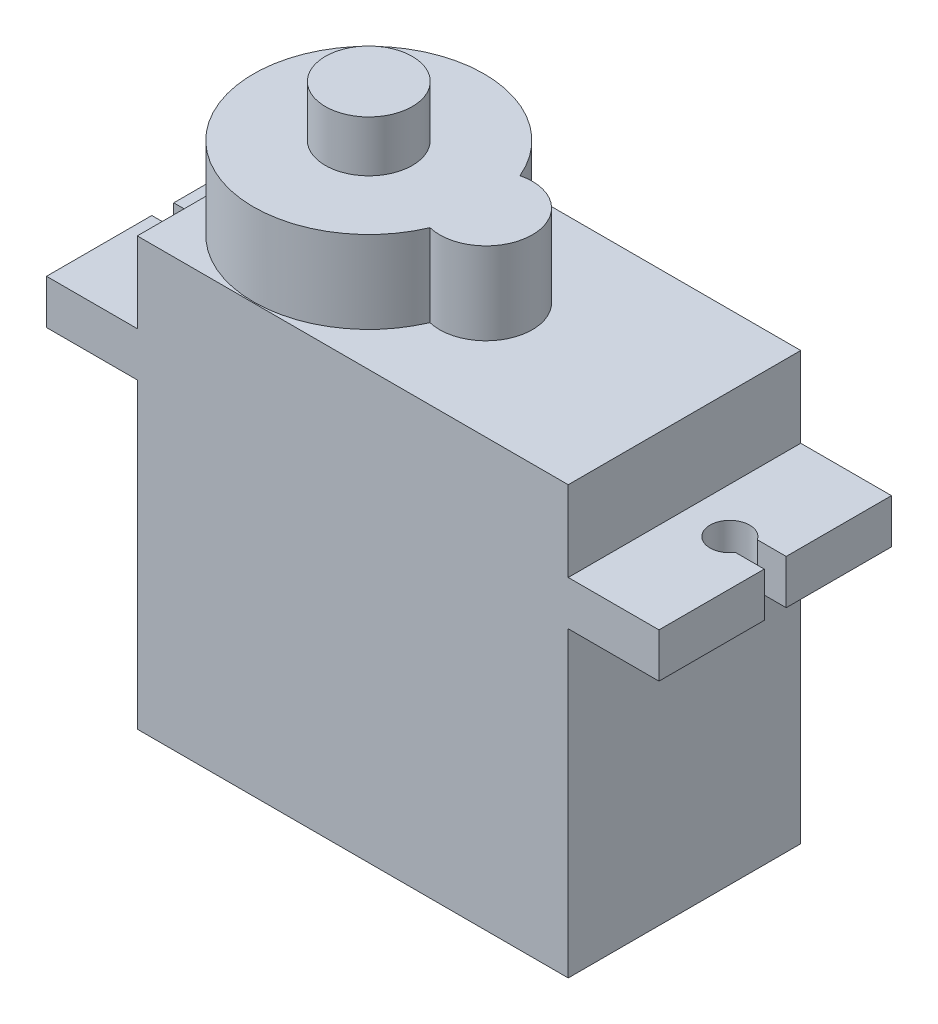
ISO-10303-21;
HEADER;
FILE_DESCRIPTION(('STEP AP214'),'2;1');
FILE_NAME('part.step','',(''),(''),'','','');
FILE_SCHEMA(('AUTOMOTIVE_DESIGN { 1 0 10303 214 1 1 1 1 }'));
ENDSEC;
DATA;
#1=APPLICATION_CONTEXT('core data for automotive mechanical design processes');
#2=APPLICATION_PROTOCOL_DEFINITION('international standard','automotive_design',2000,#1);
#3=PRODUCT_CONTEXT('',#1,'mechanical');
#4=PRODUCT('Part','Part','',(#3));
#5=PRODUCT_RELATED_PRODUCT_CATEGORY('part','',(#4));
#6=PRODUCT_DEFINITION_FORMATION('','',#4);
#7=PRODUCT_DEFINITION_CONTEXT('part definition',#1,'design');
#8=PRODUCT_DEFINITION('design','',#6,#7);
#9=PRODUCT_DEFINITION_SHAPE('','',#8);
#10=(LENGTH_UNIT() NAMED_UNIT(*) SI_UNIT(.MILLI.,.METRE.));
#11=(NAMED_UNIT(*) PLANE_ANGLE_UNIT() SI_UNIT($,.RADIAN.));
#12=(NAMED_UNIT(*) SI_UNIT($,.STERADIAN.) SOLID_ANGLE_UNIT());
#13=UNCERTAINTY_MEASURE_WITH_UNIT(LENGTH_MEASURE(1.E-05),#10,'distance_accuracy_value','');
#14=(GEOMETRIC_REPRESENTATION_CONTEXT(3) GLOBAL_UNCERTAINTY_ASSIGNED_CONTEXT((#13)) GLOBAL_UNIT_ASSIGNED_CONTEXT((#10,
#11,#12)) REPRESENTATION_CONTEXT('',''));
#15=CARTESIAN_POINT('',(0.,0.,0.));
#16=DIRECTION('',(0.,0.,1.));
#17=DIRECTION('',(1.,0.,0.));
#18=AXIS2_PLACEMENT_3D('',#15,#16,#17);
#19=CARTESIAN_POINT('',(-2.2,26.95,0.));
#20=DIRECTION('',(0.,1.,0.));
#21=DIRECTION('',(0.,0.,1.));
#22=AXIS2_PLACEMENT_3D('',#19,#20,#21);
#23=PLANE('',#22);
#24=CARTESIAN_POINT('',(0.900000000000003,26.95,0.));
#25=DIRECTION('',(0.,1.,0.));
#26=DIRECTION('',(0.,0.,1.));
#27=AXIS2_PLACEMENT_3D('',#24,#25,#26);
#28=CIRCLE('',#27,2.45195906275424);
#29=CARTESIAN_POINT('',(0.315959415691723,26.95,2.38138611764315));
#30=VERTEX_POINT('',#29);
#31=CARTESIAN_POINT('',(0.315959415691723,26.95,-2.38138611764315));
#32=VERTEX_POINT('',#31);
#33=EDGE_CURVE('E195',#30,#32,#28,.T.);
#34=ORIENTED_EDGE('',*,*,#33,.T.);
#35=CARTESIAN_POINT('',(-5.3,26.95,0.));
#36=DIRECTION('',(0.,1.,0.));
#37=DIRECTION('',(0.,0.,1.));
#38=AXIS2_PLACEMENT_3D('',#35,#36,#37);
#39=CIRCLE('',#38,6.1);
#40=EDGE_CURVE('E185',#32,#30,#39,.T.);
#41=ORIENTED_EDGE('',*,*,#40,.T.);
#42=EDGE_LOOP('',(#34,#41));
#43=FACE_BOUND('',#42,.T.);
#44=CARTESIAN_POINT('',(-5.3,26.95,0.));
#45=DIRECTION('',(0.,1.,0.));
#46=DIRECTION('',(0.,0.,1.));
#47=AXIS2_PLACEMENT_3D('',#44,#45,#46);
#48=CIRCLE('',#47,2.3);
#49=CARTESIAN_POINT('',(-5.3,26.95,-2.3));
#50=VERTEX_POINT('',#49);
#51=EDGE_CURVE('E704',#50,#50,#48,.T.);
#52=ORIENTED_EDGE('',*,*,#51,.F.);
#53=EDGE_LOOP('',(#52));
#54=FACE_BOUND('',#53,.T.);
#55=ADVANCED_FACE('F35',(#43,#54),#23,.T.);
#56=CARTESIAN_POINT('',(-11.4,22.6,6.15));
#57=DIRECTION('',(0.,-1.,0.));
#58=DIRECTION('',(0.,0.,-1.));
#59=AXIS2_PLACEMENT_3D('',#56,#57,#58);
#60=PLANE('',#59);
#61=CARTESIAN_POINT('',(0.900000000000003,22.6,0.));
#62=DIRECTION('',(0.,1.,0.));
#63=DIRECTION('',(0.,0.,1.));
#64=AXIS2_PLACEMENT_3D('',#61,#62,#63);
#65=CIRCLE('',#64,2.45195906275424);
#66=CARTESIAN_POINT('',(0.315959415691723,22.6,2.38138611764315));
#67=VERTEX_POINT('',#66);
#68=CARTESIAN_POINT('',(0.315959415691723,22.6,-2.38138611764315));
#69=VERTEX_POINT('',#68);
#70=EDGE_CURVE('E201',#67,#69,#65,.T.);
#71=ORIENTED_EDGE('',*,*,#70,.F.);
#72=CARTESIAN_POINT('',(-5.3,22.6,0.));
#73=DIRECTION('',(0.,1.,0.));
#74=DIRECTION('',(0.,0.,1.));
#75=AXIS2_PLACEMENT_3D('',#72,#73,#74);
#76=CIRCLE('',#75,6.1);
#77=CARTESIAN_POINT('',(-11.4,22.6,0.));
#78=VERTEX_POINT('',#77);
#79=EDGE_CURVE('E11',#78,#67,#76,.T.);
#80=ORIENTED_EDGE('',*,*,#79,.F.);
#81=DIRECTION('',(0.,0.,1.));
#82=VECTOR('',#81,1.);
#83=CARTESIAN_POINT('',(-11.4,22.6,-6.15));
#84=LINE('',#83,#82);
#85=CARTESIAN_POINT('',(-11.4,22.6,6.15));
#86=VERTEX_POINT('',#85);
#87=EDGE_CURVE('E253',#78,#86,#84,.T.);
#88=ORIENTED_EDGE('',*,*,#87,.T.);
#89=DIRECTION('',(1.,0.,0.));
#90=VECTOR('',#89,1.);
#91=CARTESIAN_POINT('',(11.4,22.6,6.15));
#92=LINE('',#91,#90);
#93=CARTESIAN_POINT('',(11.4,22.6,6.15));
#94=VERTEX_POINT('',#93);
#95=EDGE_CURVE('E252',#86,#94,#92,.T.);
#96=ORIENTED_EDGE('',*,*,#95,.T.);
#97=DIRECTION('',(0.,0.,-1.));
#98=VECTOR('',#97,1.);
#99=CARTESIAN_POINT('',(11.4,22.6,-6.15));
#100=LINE('',#99,#98);
#101=CARTESIAN_POINT('',(11.4,22.6,-6.15));
#102=VERTEX_POINT('',#101);
#103=EDGE_CURVE('E255',#94,#102,#100,.T.);
#104=ORIENTED_EDGE('',*,*,#103,.T.);
#105=DIRECTION('',(-1.,0.,0.));
#106=VECTOR('',#105,1.);
#107=CARTESIAN_POINT('',(11.4,22.6,-6.15));
#108=LINE('',#107,#106);
#109=CARTESIAN_POINT('',(-11.4,22.6,-6.15));
#110=VERTEX_POINT('',#109);
#111=EDGE_CURVE('E257',#102,#110,#108,.T.);
#112=ORIENTED_EDGE('',*,*,#111,.T.);
#113=EDGE_CURVE('E250',#110,#78,#84,.T.);
#114=ORIENTED_EDGE('',*,*,#113,.T.);
#115=EDGE_CURVE('E45',#69,#78,#76,.T.);
#116=ORIENTED_EDGE('',*,*,#115,.F.);
#117=EDGE_LOOP('',(#71,#80,#88,#96,#104,#112,#114,#116));
#118=FACE_BOUND('',#117,.T.);
#119=ADVANCED_FACE('F316',(#118),#60,.F.);
#120=CARTESIAN_POINT('',(-16.2,18.35,-6.15));
#121=DIRECTION('',(1.,0.,0.));
#122=DIRECTION('',(0.,0.,-1.));
#123=AXIS2_PLACEMENT_3D('',#120,#121,#122);
#124=PLANE('',#123);
#125=DIRECTION('',(0.,0.,1.));
#126=VECTOR('',#125,1.);
#127=CARTESIAN_POINT('',(-16.2,16.,-6.15));
#128=LINE('',#127,#126);
#129=CARTESIAN_POINT('',(-16.2,16.,-6.15));
#130=VERTEX_POINT('',#129);
#131=CARTESIAN_POINT('',(-16.2,16.,-0.579999999999995));
#132=VERTEX_POINT('',#131);
#133=EDGE_CURVE('E627',#130,#132,#128,.T.);
#134=ORIENTED_EDGE('',*,*,#133,.T.);
#135=DIRECTION('',(0.,1.,0.));
#136=VECTOR('',#135,1.);
#137=CARTESIAN_POINT('',(-16.2,18.35,-0.579999999999995));
#138=LINE('',#137,#136);
#139=CARTESIAN_POINT('',(-16.2,18.35,-0.579999999999995));
#140=VERTEX_POINT('',#139);
#141=EDGE_CURVE('E278',#132,#140,#138,.T.);
#142=ORIENTED_EDGE('',*,*,#141,.T.);
#143=DIRECTION('',(0.,0.,1.));
#144=VECTOR('',#143,1.);
#145=CARTESIAN_POINT('',(-16.2,18.35,-6.15));
#146=LINE('',#145,#144);
#147=CARTESIAN_POINT('',(-16.2,18.35,-6.15));
#148=VERTEX_POINT('',#147);
#149=EDGE_CURVE('E302',#148,#140,#146,.T.);
#150=ORIENTED_EDGE('',*,*,#149,.F.);
#151=DIRECTION('',(0.,-1.,0.));
#152=VECTOR('',#151,1.);
#153=CARTESIAN_POINT('',(-16.2,18.35,-6.15));
#154=LINE('',#153,#152);
#155=EDGE_CURVE('E590',#148,#130,#154,.T.);
#156=ORIENTED_EDGE('',*,*,#155,.T.);
#157=EDGE_LOOP('',(#134,#142,#150,#156));
#158=FACE_BOUND('',#157,.T.);
#159=ADVANCED_FACE('F321',(#158),#124,.F.);
#160=CARTESIAN_POINT('',(16.2,18.35,-6.15));
#161=DIRECTION('',(-1.,0.,0.));
#162=DIRECTION('',(0.,0.,1.));
#163=AXIS2_PLACEMENT_3D('',#160,#161,#162);
#164=PLANE('',#163);
#165=DIRECTION('',(0.,0.,-1.));
#166=VECTOR('',#165,1.);
#167=CARTESIAN_POINT('',(16.2,16.,-6.15));
#168=LINE('',#167,#166);
#169=CARTESIAN_POINT('',(16.2,16.,6.15));
#170=VERTEX_POINT('',#169);
#171=CARTESIAN_POINT('',(16.2,16.,0.579999999999998));
#172=VERTEX_POINT('',#171);
#173=EDGE_CURVE('E621',#170,#172,#168,.T.);
#174=ORIENTED_EDGE('',*,*,#173,.T.);
#175=DIRECTION('',(0.,1.,0.));
#176=VECTOR('',#175,1.);
#177=CARTESIAN_POINT('',(16.2,14.1,0.579999999999998));
#178=LINE('',#177,#176);
#179=CARTESIAN_POINT('',(16.2,18.35,0.579999999999998));
#180=VERTEX_POINT('',#179);
#181=EDGE_CURVE('E232',#172,#180,#178,.T.);
#182=ORIENTED_EDGE('',*,*,#181,.T.);
#183=DIRECTION('',(0.,0.,-1.));
#184=VECTOR('',#183,1.);
#185=CARTESIAN_POINT('',(16.2,18.35,-6.15));
#186=LINE('',#185,#184);
#187=CARTESIAN_POINT('',(16.2,18.35,6.15));
#188=VERTEX_POINT('',#187);
#189=EDGE_CURVE('E668',#188,#180,#186,.T.);
#190=ORIENTED_EDGE('',*,*,#189,.F.);
#191=DIRECTION('',(0.,-1.,0.));
#192=VECTOR('',#191,1.);
#193=CARTESIAN_POINT('',(16.2,18.35,6.15));
#194=LINE('',#193,#192);
#195=EDGE_CURVE('E634',#188,#170,#194,.T.);
#196=ORIENTED_EDGE('',*,*,#195,.T.);
#197=EDGE_LOOP('',(#174,#182,#190,#196));
#198=FACE_BOUND('',#197,.T.);
#199=ADVANCED_FACE('F430',(#198),#164,.F.);
#200=CARTESIAN_POINT('',(16.2,18.35,6.15));
#201=DIRECTION('',(0.,1.,0.));
#202=DIRECTION('',(0.,0.,1.));
#203=AXIS2_PLACEMENT_3D('',#200,#201,#202);
#204=PLANE('',#203);
#205=DIRECTION('',(-1.,0.,0.));
#206=VECTOR('',#205,1.);
#207=CARTESIAN_POINT('',(-16.2,18.35,-0.579999999999995));
#208=LINE('',#207,#206);
#209=CARTESIAN_POINT('',(-14.6752713864854,18.35,-0.579999999999995));
#210=VERTEX_POINT('',#209);
#211=EDGE_CURVE('E211',#210,#140,#208,.T.);
#212=ORIENTED_EDGE('',*,*,#211,.F.);
#213=CARTESIAN_POINT('',(-13.8,18.35,0.));
#214=DIRECTION('',(0.,1.,0.));
#215=DIRECTION('',(0.,0.,-1.));
#216=AXIS2_PLACEMENT_3D('',#213,#214,#215);
#217=CIRCLE('',#216,1.05);
#218=CARTESIAN_POINT('',(-14.6752713864854,18.35,0.580000000000003));
#219=VERTEX_POINT('',#218);
#220=EDGE_CURVE('E205',#219,#210,#217,.T.);
#221=ORIENTED_EDGE('',*,*,#220,.F.);
#222=DIRECTION('',(1.,0.,0.));
#223=VECTOR('',#222,1.);
#224=CARTESIAN_POINT('',(-16.2,18.35,0.580000000000004));
#225=LINE('',#224,#223);
#226=CARTESIAN_POINT('',(-16.2,18.35,0.580000000000004));
#227=VERTEX_POINT('',#226);
#228=EDGE_CURVE('E202',#227,#219,#225,.T.);
#229=ORIENTED_EDGE('',*,*,#228,.F.);
#230=CARTESIAN_POINT('',(-16.2,18.35,6.15));
#231=VERTEX_POINT('',#230);
#232=EDGE_CURVE('E666',#227,#231,#146,.T.);
#233=ORIENTED_EDGE('',*,*,#232,.T.);
#234=DIRECTION('',(1.,0.,0.));
#235=VECTOR('',#234,1.);
#236=CARTESIAN_POINT('',(-16.2,18.35,6.15));
#237=LINE('',#236,#235);
#238=CARTESIAN_POINT('',(-11.4,18.35,6.15));
#239=VERTEX_POINT('',#238);
#240=EDGE_CURVE('E649',#231,#239,#237,.T.);
#241=ORIENTED_EDGE('',*,*,#240,.T.);
#242=DIRECTION('',(0.,0.,1.));
#243=VECTOR('',#242,1.);
#244=CARTESIAN_POINT('',(-11.4,18.35,-6.15));
#245=LINE('',#244,#243);
#246=CARTESIAN_POINT('',(-11.4,18.35,-6.15));
#247=VERTEX_POINT('',#246);
#248=EDGE_CURVE('E249',#247,#239,#245,.T.);
#249=ORIENTED_EDGE('',*,*,#248,.F.);
#250=DIRECTION('',(-1.,0.,0.));
#251=VECTOR('',#250,1.);
#252=CARTESIAN_POINT('',(-16.2,18.35,-6.15));
#253=LINE('',#252,#251);
#254=EDGE_CURVE('E659',#247,#148,#253,.T.);
#255=ORIENTED_EDGE('',*,*,#254,.T.);
#256=ORIENTED_EDGE('',*,*,#149,.T.);
#257=EDGE_LOOP('',(#212,#221,#229,#233,#241,#249,#255,#256));
#258=FACE_BOUND('',#257,.T.);
#259=ADVANCED_FACE('F301',(#258),#204,.T.);
#260=CARTESIAN_POINT('',(-11.4,16.,-6.15));
#261=DIRECTION('',(1.,0.,0.));
#262=DIRECTION('',(0.,0.,-1.));
#263=AXIS2_PLACEMENT_3D('',#260,#261,#262);
#264=PLANE('',#263);
#265=DIRECTION('',(0.,0.,1.));
#266=VECTOR('',#265,1.);
#267=CARTESIAN_POINT('',(-11.4,0.,-6.15));
#268=LINE('',#267,#266);
#269=CARTESIAN_POINT('',(-11.4,0.,-6.15));
#270=VERTEX_POINT('',#269);
#271=CARTESIAN_POINT('',(-11.4,0.,6.15));
#272=VERTEX_POINT('',#271);
#273=EDGE_CURVE('E578',#270,#272,#268,.T.);
#274=ORIENTED_EDGE('',*,*,#273,.T.);
#275=DIRECTION('',(0.,-1.,0.));
#276=VECTOR('',#275,1.);
#277=CARTESIAN_POINT('',(-11.4,16.,6.15));
#278=LINE('',#277,#276);
#279=CARTESIAN_POINT('',(-11.4,16.,6.15));
#280=VERTEX_POINT('',#279);
#281=EDGE_CURVE('E279',#280,#272,#278,.T.);
#282=ORIENTED_EDGE('',*,*,#281,.F.);
#283=DIRECTION('',(0.,0.,1.));
#284=VECTOR('',#283,1.);
#285=CARTESIAN_POINT('',(-11.4,16.,-6.15));
#286=LINE('',#285,#284);
#287=CARTESIAN_POINT('',(-11.4,16.,-6.15));
#288=VERTEX_POINT('',#287);
#289=EDGE_CURVE('E599',#288,#280,#286,.T.);
#290=ORIENTED_EDGE('',*,*,#289,.F.);
#291=DIRECTION('',(0.,-1.,0.));
#292=VECTOR('',#291,1.);
#293=CARTESIAN_POINT('',(-11.4,16.,-6.15));
#294=LINE('',#293,#292);
#295=EDGE_CURVE('E582',#288,#270,#294,.T.);
#296=ORIENTED_EDGE('',*,*,#295,.T.);
#297=EDGE_LOOP('',(#274,#282,#290,#296));
#298=FACE_BOUND('',#297,.T.);
#299=ADVANCED_FACE('F37',(#298),#264,.F.);
#300=CARTESIAN_POINT('',(11.4,16.,6.15));
#301=DIRECTION('',(0.,0.,-1.));
#302=DIRECTION('',(-1.,0.,0.));
#303=AXIS2_PLACEMENT_3D('',#300,#301,#302);
#304=PLANE('',#303);
#305=DIRECTION('',(1.,0.,0.));
#306=VECTOR('',#305,1.);
#307=CARTESIAN_POINT('',(11.4,0.,6.15));
#308=LINE('',#307,#306);
#309=CARTESIAN_POINT('',(11.4,0.,6.15));
#310=VERTEX_POINT('',#309);
#311=EDGE_CURVE('E584',#272,#310,#308,.T.);
#312=ORIENTED_EDGE('',*,*,#311,.T.);
#313=DIRECTION('',(0.,-1.,0.));
#314=VECTOR('',#313,1.);
#315=CARTESIAN_POINT('',(11.4,16.,6.15));
#316=LINE('',#315,#314);
#317=CARTESIAN_POINT('',(11.4,16.,6.15));
#318=VERTEX_POINT('',#317);
#319=EDGE_CURVE('E603',#318,#310,#316,.T.);
#320=ORIENTED_EDGE('',*,*,#319,.F.);
#321=DIRECTION('',(1.,0.,0.));
#322=VECTOR('',#321,1.);
#323=CARTESIAN_POINT('',(-16.2,16.,6.15));
#324=LINE('',#323,#322);
#325=EDGE_CURVE('E630',#318,#170,#324,.T.);
#326=ORIENTED_EDGE('',*,*,#325,.T.);
#327=ORIENTED_EDGE('',*,*,#195,.F.);
#328=CARTESIAN_POINT('',(11.4,18.35,6.15));
#329=VERTEX_POINT('',#328);
#330=EDGE_CURVE('E654',#329,#188,#237,.T.);
#331=ORIENTED_EDGE('',*,*,#330,.F.);
#332=DIRECTION('',(0.,-1.,0.));
#333=VECTOR('',#332,1.);
#334=CARTESIAN_POINT('',(11.4,22.6,6.15));
#335=LINE('',#334,#333);
#336=EDGE_CURVE('E715',#94,#329,#335,.T.);
#337=ORIENTED_EDGE('',*,*,#336,.F.);
#338=ORIENTED_EDGE('',*,*,#95,.F.);
#339=DIRECTION('',(0.,-1.,0.));
#340=VECTOR('',#339,1.);
#341=CARTESIAN_POINT('',(-11.4,22.6,6.15));
#342=LINE('',#341,#340);
#343=EDGE_CURVE('E693',#86,#239,#342,.T.);
#344=ORIENTED_EDGE('',*,*,#343,.T.);
#345=ORIENTED_EDGE('',*,*,#240,.F.);
#346=DIRECTION('',(0.,-1.,0.));
#347=VECTOR('',#346,1.);
#348=CARTESIAN_POINT('',(-16.2,18.35,6.15));
#349=LINE('',#348,#347);
#350=CARTESIAN_POINT('',(-16.2,16.,6.15));
#351=VERTEX_POINT('',#350);
#352=EDGE_CURVE('E643',#231,#351,#349,.T.);
#353=ORIENTED_EDGE('',*,*,#352,.T.);
#354=EDGE_CURVE('E638',#351,#280,#324,.T.);
#355=ORIENTED_EDGE('',*,*,#354,.T.);
#356=ORIENTED_EDGE('',*,*,#281,.T.);
#357=EDGE_LOOP('',(#312,#320,#326,#327,#331,#337,#338,#344,#345,#353,#355,#356));
#358=FACE_BOUND('',#357,.T.);
#359=ADVANCED_FACE('F479',(#358),#304,.F.);
#360=CARTESIAN_POINT('',(11.4,16.,-6.15));
#361=DIRECTION('',(-1.,0.,0.));
#362=DIRECTION('',(0.,0.,1.));
#363=AXIS2_PLACEMENT_3D('',#360,#361,#362);
#364=PLANE('',#363);
#365=DIRECTION('',(0.,0.,-1.));
#366=VECTOR('',#365,1.);
#367=CARTESIAN_POINT('',(11.4,0.,-6.15));
#368=LINE('',#367,#366);
#369=CARTESIAN_POINT('',(11.4,0.,-6.15));
#370=VERTEX_POINT('',#369);
#371=EDGE_CURVE('E587',#310,#370,#368,.T.);
#372=ORIENTED_EDGE('',*,*,#371,.T.);
#373=DIRECTION('',(0.,-1.,0.));
#374=VECTOR('',#373,1.);
#375=CARTESIAN_POINT('',(11.4,16.,-6.15));
#376=LINE('',#375,#374);
#377=CARTESIAN_POINT('',(11.4,16.,-6.15));
#378=VERTEX_POINT('',#377);
#379=EDGE_CURVE('E600',#378,#370,#376,.T.);
#380=ORIENTED_EDGE('',*,*,#379,.F.);
#381=DIRECTION('',(0.,0.,-1.));
#382=VECTOR('',#381,1.);
#383=CARTESIAN_POINT('',(11.4,16.,-6.15));
#384=LINE('',#383,#382);
#385=EDGE_CURVE('E606',#318,#378,#384,.T.);
#386=ORIENTED_EDGE('',*,*,#385,.F.);
#387=ORIENTED_EDGE('',*,*,#319,.T.);
#388=EDGE_LOOP('',(#372,#380,#386,#387));
#389=FACE_BOUND('',#388,.T.);
#390=ADVANCED_FACE('F469',(#389),#364,.F.);
#391=CARTESIAN_POINT('',(11.4,16.,-6.15));
#392=DIRECTION('',(0.,0.,1.));
#393=DIRECTION('',(1.,0.,0.));
#394=AXIS2_PLACEMENT_3D('',#391,#392,#393);
#395=PLANE('',#394);
#396=DIRECTION('',(-1.,0.,0.));
#397=VECTOR('',#396,1.);
#398=CARTESIAN_POINT('',(11.4,0.,-6.15));
#399=LINE('',#398,#397);
#400=EDGE_CURVE('E597',#370,#270,#399,.T.);
#401=ORIENTED_EDGE('',*,*,#400,.T.);
#402=ORIENTED_EDGE('',*,*,#295,.F.);
#403=DIRECTION('',(-1.,0.,0.));
#404=VECTOR('',#403,1.);
#405=CARTESIAN_POINT('',(-16.2,16.,-6.15));
#406=LINE('',#405,#404);
#407=EDGE_CURVE('E617',#288,#130,#406,.T.);
#408=ORIENTED_EDGE('',*,*,#407,.T.);
#409=ORIENTED_EDGE('',*,*,#155,.F.);
#410=ORIENTED_EDGE('',*,*,#254,.F.);
#411=DIRECTION('',(0.,-1.,0.));
#412=VECTOR('',#411,1.);
#413=CARTESIAN_POINT('',(-11.4,22.6,-6.15));
#414=LINE('',#413,#412);
#415=EDGE_CURVE('E259',#110,#247,#414,.T.);
#416=ORIENTED_EDGE('',*,*,#415,.F.);
#417=ORIENTED_EDGE('',*,*,#111,.F.);
#418=DIRECTION('',(0.,-1.,0.));
#419=VECTOR('',#418,1.);
#420=CARTESIAN_POINT('',(11.4,22.6,-6.15));
#421=LINE('',#420,#419);
#422=CARTESIAN_POINT('',(11.4,18.35,-6.15));
#423=VERTEX_POINT('',#422);
#424=EDGE_CURVE('E273',#102,#423,#421,.T.);
#425=ORIENTED_EDGE('',*,*,#424,.T.);
#426=CARTESIAN_POINT('',(16.2,18.35,-6.15));
#427=VERTEX_POINT('',#426);
#428=EDGE_CURVE('E670',#427,#423,#253,.T.);
#429=ORIENTED_EDGE('',*,*,#428,.F.);
#430=DIRECTION('',(0.,-1.,0.));
#431=VECTOR('',#430,1.);
#432=CARTESIAN_POINT('',(16.2,18.35,-6.15));
#433=LINE('',#432,#431);
#434=CARTESIAN_POINT('',(16.2,16.,-6.15));
#435=VERTEX_POINT('',#434);
#436=EDGE_CURVE('E585',#427,#435,#433,.T.);
#437=ORIENTED_EDGE('',*,*,#436,.T.);
#438=EDGE_CURVE('E620',#435,#378,#406,.T.);
#439=ORIENTED_EDGE('',*,*,#438,.T.);
#440=ORIENTED_EDGE('',*,*,#379,.T.);
#441=EDGE_LOOP('',(#401,#402,#408,#409,#410,#416,#417,#425,#429,#437,#439,#440));
#442=FACE_BOUND('',#441,.T.);
#443=ADVANCED_FACE('F462',(#442),#395,.F.);
#444=CARTESIAN_POINT('',(-11.4,0.,6.15));
#445=DIRECTION('',(0.,-1.,0.));
#446=DIRECTION('',(0.,0.,-1.));
#447=AXIS2_PLACEMENT_3D('',#444,#445,#446);
#448=PLANE('',#447);
#449=ORIENTED_EDGE('',*,*,#273,.F.);
#450=ORIENTED_EDGE('',*,*,#400,.F.);
#451=ORIENTED_EDGE('',*,*,#371,.F.);
#452=ORIENTED_EDGE('',*,*,#311,.F.);
#453=EDGE_LOOP('',(#449,#450,#451,#452));
#454=FACE_BOUND('',#453,.T.);
#455=ADVANCED_FACE('F468',(#454),#448,.T.);
#456=CARTESIAN_POINT('',(16.2,16.,6.15));
#457=DIRECTION('',(0.,1.,0.));
#458=DIRECTION('',(0.,0.,1.));
#459=AXIS2_PLACEMENT_3D('',#456,#457,#458);
#460=PLANE('',#459);
#461=CARTESIAN_POINT('',(-13.8,16.,0.));
#462=DIRECTION('',(0.,1.,0.));
#463=DIRECTION('',(0.,0.,1.));
#464=AXIS2_PLACEMENT_3D('',#461,#462,#463);
#465=CIRCLE('',#464,1.05);
#466=CARTESIAN_POINT('',(-14.6752713864854,16.,0.580000000000003));
#467=VERTEX_POINT('',#466);
#468=CARTESIAN_POINT('',(-14.6752713864854,16.,-0.579999999999995));
#469=VERTEX_POINT('',#468);
#470=EDGE_CURVE('E39',#467,#469,#465,.T.);
#471=ORIENTED_EDGE('',*,*,#470,.T.);
#472=DIRECTION('',(-1.,0.,0.));
#473=VECTOR('',#472,1.);
#474=CARTESIAN_POINT('',(16.2,16.,-0.579999999999995));
#475=LINE('',#474,#473);
#476=EDGE_CURVE('E220',#469,#132,#475,.T.);
#477=ORIENTED_EDGE('',*,*,#476,.T.);
#478=ORIENTED_EDGE('',*,*,#133,.F.);
#479=ORIENTED_EDGE('',*,*,#407,.F.);
#480=ORIENTED_EDGE('',*,*,#289,.T.);
#481=ORIENTED_EDGE('',*,*,#354,.F.);
#482=CARTESIAN_POINT('',(-16.2,16.,0.580000000000003));
#483=VERTEX_POINT('',#482);
#484=EDGE_CURVE('E631',#483,#351,#128,.T.);
#485=ORIENTED_EDGE('',*,*,#484,.F.);
#486=DIRECTION('',(1.,0.,0.));
#487=VECTOR('',#486,1.);
#488=CARTESIAN_POINT('',(16.2,16.,0.580000000000017));
#489=LINE('',#488,#487);
#490=EDGE_CURVE('E216',#483,#467,#489,.T.);
#491=ORIENTED_EDGE('',*,*,#490,.T.);
#492=EDGE_LOOP('',(#471,#477,#478,#479,#480,#481,#485,#491));
#493=FACE_BOUND('',#492,.T.);
#494=ADVANCED_FACE('F287',(#493),#460,.F.);
#495=CARTESIAN_POINT('',(13.8,16.,0.));
#496=DIRECTION('',(0.,1.,0.));
#497=DIRECTION('',(0.,0.,1.));
#498=AXIS2_PLACEMENT_3D('',#495,#496,#497);
#499=CIRCLE('',#498,1.05);
#500=CARTESIAN_POINT('',(14.6752713864854,16.,-0.58));
#501=VERTEX_POINT('',#500);
#502=CARTESIAN_POINT('',(14.6752713864854,16.,0.579999999999999));
#503=VERTEX_POINT('',#502);
#504=EDGE_CURVE('E243',#501,#503,#499,.T.);
#505=ORIENTED_EDGE('',*,*,#504,.T.);
#506=DIRECTION('',(1.,0.,0.));
#507=VECTOR('',#506,1.);
#508=CARTESIAN_POINT('',(16.2,16.,0.579999999999998));
#509=LINE('',#508,#507);
#510=EDGE_CURVE('E246',#503,#172,#509,.T.);
#511=ORIENTED_EDGE('',*,*,#510,.T.);
#512=ORIENTED_EDGE('',*,*,#173,.F.);
#513=ORIENTED_EDGE('',*,*,#325,.F.);
#514=ORIENTED_EDGE('',*,*,#385,.T.);
#515=ORIENTED_EDGE('',*,*,#438,.F.);
#516=CARTESIAN_POINT('',(16.2,16.,-0.58));
#517=VERTEX_POINT('',#516);
#518=EDGE_CURVE('E691',#517,#435,#168,.T.);
#519=ORIENTED_EDGE('',*,*,#518,.F.);
#520=DIRECTION('',(-1.,0.,0.));
#521=VECTOR('',#520,1.);
#522=CARTESIAN_POINT('',(16.2,16.,-0.58));
#523=LINE('',#522,#521);
#524=EDGE_CURVE('E235',#517,#501,#523,.T.);
#525=ORIENTED_EDGE('',*,*,#524,.T.);
#526=EDGE_LOOP('',(#505,#511,#512,#513,#514,#515,#519,#525));
#527=FACE_BOUND('',#526,.T.);
#528=ADVANCED_FACE('F516',(#527),#460,.F.);
#529=CARTESIAN_POINT('',(16.2,18.35,-0.580000000000001));
#530=VERTEX_POINT('',#529);
#531=EDGE_CURVE('E640',#530,#427,#186,.T.);
#532=ORIENTED_EDGE('',*,*,#531,.F.);
#533=DIRECTION('',(0.,1.,0.));
#534=VECTOR('',#533,1.);
#535=CARTESIAN_POINT('',(16.2,14.1,-0.58));
#536=LINE('',#535,#534);
#537=EDGE_CURVE('E231',#517,#530,#536,.T.);
#538=ORIENTED_EDGE('',*,*,#537,.F.);
#539=ORIENTED_EDGE('',*,*,#518,.T.);
#540=ORIENTED_EDGE('',*,*,#436,.F.);
#541=EDGE_LOOP('',(#532,#538,#539,#540));
#542=FACE_BOUND('',#541,.T.);
#543=ADVANCED_FACE('F442',(#542),#164,.F.);
#544=ORIENTED_EDGE('',*,*,#232,.F.);
#545=DIRECTION('',(0.,-1.,0.));
#546=VECTOR('',#545,1.);
#547=CARTESIAN_POINT('',(-16.2,18.35,0.580000000000003));
#548=LINE('',#547,#546);
#549=EDGE_CURVE('E276',#227,#483,#548,.T.);
#550=ORIENTED_EDGE('',*,*,#549,.T.);
#551=ORIENTED_EDGE('',*,*,#484,.T.);
#552=ORIENTED_EDGE('',*,*,#352,.F.);
#553=EDGE_LOOP('',(#544,#550,#551,#552));
#554=FACE_BOUND('',#553,.T.);
#555=ADVANCED_FACE('F432',(#554),#124,.F.);
#556=DIRECTION('',(1.,0.,0.));
#557=VECTOR('',#556,1.);
#558=CARTESIAN_POINT('',(16.2,18.35,0.579999999999998));
#559=LINE('',#558,#557);
#560=CARTESIAN_POINT('',(14.6752713864854,18.35,0.579999999999999));
#561=VERTEX_POINT('',#560);
#562=EDGE_CURVE('E229',#561,#180,#559,.T.);
#563=ORIENTED_EDGE('',*,*,#562,.F.);
#564=CARTESIAN_POINT('',(13.8,18.35,0.));
#565=DIRECTION('',(0.,1.,0.));
#566=DIRECTION('',(0.,0.,1.));
#567=AXIS2_PLACEMENT_3D('',#564,#565,#566);
#568=CIRCLE('',#567,1.05);
#569=CARTESIAN_POINT('',(14.6752713864854,18.35,-0.58));
#570=VERTEX_POINT('',#569);
#571=EDGE_CURVE('E226',#570,#561,#568,.T.);
#572=ORIENTED_EDGE('',*,*,#571,.F.);
#573=DIRECTION('',(-1.,0.,0.));
#574=VECTOR('',#573,1.);
#575=CARTESIAN_POINT('',(16.2,18.35,-0.58));
#576=LINE('',#575,#574);
#577=EDGE_CURVE('E223',#530,#570,#576,.T.);
#578=ORIENTED_EDGE('',*,*,#577,.F.);
#579=ORIENTED_EDGE('',*,*,#531,.T.);
#580=ORIENTED_EDGE('',*,*,#428,.T.);
#581=DIRECTION('',(0.,0.,-1.));
#582=VECTOR('',#581,1.);
#583=CARTESIAN_POINT('',(11.4,18.35,-6.15));
#584=LINE('',#583,#582);
#585=EDGE_CURVE('E268',#329,#423,#584,.T.);
#586=ORIENTED_EDGE('',*,*,#585,.F.);
#587=ORIENTED_EDGE('',*,*,#330,.T.);
#588=ORIENTED_EDGE('',*,*,#189,.T.);
#589=EDGE_LOOP('',(#563,#572,#578,#579,#580,#586,#587,#588));
#590=FACE_BOUND('',#589,.T.);
#591=ADVANCED_FACE('F458',(#590),#204,.T.);
#592=CARTESIAN_POINT('',(-11.4,22.6,-6.15));
#593=DIRECTION('',(1.,0.,0.));
#594=DIRECTION('',(0.,0.,-1.));
#595=AXIS2_PLACEMENT_3D('',#592,#593,#594);
#596=PLANE('',#595);
#597=ORIENTED_EDGE('',*,*,#248,.T.);
#598=ORIENTED_EDGE('',*,*,#343,.F.);
#599=ORIENTED_EDGE('',*,*,#87,.F.);
#600=ORIENTED_EDGE('',*,*,#113,.F.);
#601=ORIENTED_EDGE('',*,*,#415,.T.);
#602=EDGE_LOOP('',(#597,#598,#599,#600,#601));
#603=FACE_BOUND('',#602,.T.);
#604=ADVANCED_FACE('F449',(#603),#596,.F.);
#605=CARTESIAN_POINT('',(11.4,22.6,-6.15));
#606=DIRECTION('',(-1.,0.,0.));
#607=DIRECTION('',(0.,0.,1.));
#608=AXIS2_PLACEMENT_3D('',#605,#606,#607);
#609=PLANE('',#608);
#610=ORIENTED_EDGE('',*,*,#585,.T.);
#611=ORIENTED_EDGE('',*,*,#424,.F.);
#612=ORIENTED_EDGE('',*,*,#103,.F.);
#613=ORIENTED_EDGE('',*,*,#336,.T.);
#614=EDGE_LOOP('',(#610,#611,#612,#613));
#615=FACE_BOUND('',#614,.T.);
#616=ADVANCED_FACE('F420',(#615),#609,.F.);
#617=CARTESIAN_POINT('',(16.2,14.1,0.579999999999998));
#618=DIRECTION('',(0.,0.,1.));
#619=DIRECTION('',(1.,0.,0.));
#620=AXIS2_PLACEMENT_3D('',#617,#618,#619);
#621=PLANE('',#620);
#622=DIRECTION('',(0.,1.,0.));
#623=VECTOR('',#622,1.);
#624=CARTESIAN_POINT('',(14.6752713864854,14.1,0.579999999999999));
#625=LINE('',#624,#623);
#626=EDGE_CURVE('E236',#503,#561,#625,.T.);
#627=ORIENTED_EDGE('',*,*,#626,.T.);
#628=ORIENTED_EDGE('',*,*,#562,.T.);
#629=ORIENTED_EDGE('',*,*,#181,.F.);
#630=ORIENTED_EDGE('',*,*,#510,.F.);
#631=EDGE_LOOP('',(#627,#628,#629,#630));
#632=FACE_BOUND('',#631,.T.);
#633=ADVANCED_FACE('F411',(#632),#621,.F.);
#634=CARTESIAN_POINT('',(13.8,14.1,0.));
#635=DIRECTION('',(0.,1.,0.));
#636=DIRECTION('',(0.,0.,1.));
#637=AXIS2_PLACEMENT_3D('',#634,#635,#636);
#638=CYLINDRICAL_SURFACE('',#637,1.05);
#639=DIRECTION('',(0.,1.,0.));
#640=VECTOR('',#639,1.);
#641=CARTESIAN_POINT('',(14.6752713864854,14.1,-0.58));
#642=LINE('',#641,#640);
#643=EDGE_CURVE('E238',#501,#570,#642,.T.);
#644=ORIENTED_EDGE('',*,*,#643,.T.);
#645=ORIENTED_EDGE('',*,*,#571,.T.);
#646=ORIENTED_EDGE('',*,*,#626,.F.);
#647=ORIENTED_EDGE('',*,*,#504,.F.);
#648=EDGE_LOOP('',(#644,#645,#646,#647));
#649=FACE_BOUND('',#648,.T.);
#650=ADVANCED_FACE('F402',(#649),#638,.F.);
#651=CARTESIAN_POINT('',(16.2,14.1,-0.58));
#652=DIRECTION('',(0.,0.,-1.));
#653=DIRECTION('',(-1.,0.,0.));
#654=AXIS2_PLACEMENT_3D('',#651,#652,#653);
#655=PLANE('',#654);
#656=ORIENTED_EDGE('',*,*,#537,.T.);
#657=ORIENTED_EDGE('',*,*,#577,.T.);
#658=ORIENTED_EDGE('',*,*,#643,.F.);
#659=ORIENTED_EDGE('',*,*,#524,.F.);
#660=EDGE_LOOP('',(#656,#657,#658,#659));
#661=FACE_BOUND('',#660,.T.);
#662=ADVANCED_FACE('F312',(#661),#655,.F.);
#663=CARTESIAN_POINT('',(-13.8,14.1,0.));
#664=DIRECTION('',(0.,1.,0.));
#665=DIRECTION('',(0.,0.,1.));
#666=AXIS2_PLACEMENT_3D('',#663,#664,#665);
#667=CYLINDRICAL_SURFACE('',#666,1.05);
#668=DIRECTION('',(0.,1.,0.));
#669=VECTOR('',#668,1.);
#670=CARTESIAN_POINT('',(-14.6752713864854,14.1,0.580000000000003));
#671=LINE('',#670,#669);
#672=EDGE_CURVE('E213',#467,#219,#671,.T.);
#673=ORIENTED_EDGE('',*,*,#672,.T.);
#674=ORIENTED_EDGE('',*,*,#220,.T.);
#675=DIRECTION('',(0.,1.,0.));
#676=VECTOR('',#675,1.);
#677=CARTESIAN_POINT('',(-14.6752713864854,14.1,-0.579999999999995));
#678=LINE('',#677,#676);
#679=EDGE_CURVE('E214',#469,#210,#678,.T.);
#680=ORIENTED_EDGE('',*,*,#679,.F.);
#681=ORIENTED_EDGE('',*,*,#470,.F.);
#682=EDGE_LOOP('',(#673,#674,#680,#681));
#683=FACE_BOUND('',#682,.T.);
#684=ADVANCED_FACE('F293',(#683),#667,.F.);
#685=CARTESIAN_POINT('',(-16.2,14.1,-0.579999999999995));
#686=DIRECTION('',(0.,0.,-1.));
#687=DIRECTION('',(-1.,0.,0.));
#688=AXIS2_PLACEMENT_3D('',#685,#686,#687);
#689=PLANE('',#688);
#690=ORIENTED_EDGE('',*,*,#679,.T.);
#691=ORIENTED_EDGE('',*,*,#211,.T.);
#692=ORIENTED_EDGE('',*,*,#141,.F.);
#693=ORIENTED_EDGE('',*,*,#476,.F.);
#694=EDGE_LOOP('',(#690,#691,#692,#693));
#695=FACE_BOUND('',#694,.T.);
#696=ADVANCED_FACE('F304',(#695),#689,.F.);
#697=CARTESIAN_POINT('',(-16.2,14.1,0.580000000000004));
#698=DIRECTION('',(0.,0.,1.));
#699=DIRECTION('',(1.,0.,0.));
#700=AXIS2_PLACEMENT_3D('',#697,#698,#699);
#701=PLANE('',#700);
#702=ORIENTED_EDGE('',*,*,#549,.F.);
#703=ORIENTED_EDGE('',*,*,#228,.T.);
#704=ORIENTED_EDGE('',*,*,#672,.F.);
#705=ORIENTED_EDGE('',*,*,#490,.F.);
#706=EDGE_LOOP('',(#702,#703,#704,#705));
#707=FACE_BOUND('',#706,.T.);
#708=ADVANCED_FACE('F295',(#707),#701,.F.);
#709=CARTESIAN_POINT('',(0.900000000000003,26.95,0.));
#710=DIRECTION('',(0.,-1.,0.));
#711=DIRECTION('',(0.,0.,-1.));
#712=AXIS2_PLACEMENT_3D('',#709,#710,#711);
#713=CYLINDRICAL_SURFACE('',#712,2.45195906275424);
#714=ORIENTED_EDGE('',*,*,#70,.T.);
#715=DIRECTION('',(0.,-1.,0.));
#716=VECTOR('',#715,1.);
#717=CARTESIAN_POINT('',(0.315959415691723,26.95,-2.38138611764315));
#718=LINE('',#717,#716);
#719=EDGE_CURVE('E189',#32,#69,#718,.T.);
#720=ORIENTED_EDGE('',*,*,#719,.F.);
#721=ORIENTED_EDGE('',*,*,#33,.F.);
#722=DIRECTION('',(0.,-1.,0.));
#723=VECTOR('',#722,1.);
#724=CARTESIAN_POINT('',(0.315959415691723,26.95,2.38138611764315));
#725=LINE('',#724,#723);
#726=EDGE_CURVE('E192',#30,#67,#725,.T.);
#727=ORIENTED_EDGE('',*,*,#726,.T.);
#728=EDGE_LOOP('',(#714,#720,#721,#727));
#729=FACE_BOUND('',#728,.T.);
#730=ADVANCED_FACE('F200',(#729),#713,.T.);
#731=CARTESIAN_POINT('',(-5.3,26.95,0.));
#732=DIRECTION('',(0.,-1.,0.));
#733=DIRECTION('',(0.,0.,-1.));
#734=AXIS2_PLACEMENT_3D('',#731,#732,#733);
#735=CYLINDRICAL_SURFACE('',#734,6.1);
#736=ORIENTED_EDGE('',*,*,#115,.T.);
#737=ORIENTED_EDGE('',*,*,#79,.T.);
#738=ORIENTED_EDGE('',*,*,#726,.F.);
#739=ORIENTED_EDGE('',*,*,#40,.F.);
#740=ORIENTED_EDGE('',*,*,#719,.T.);
#741=EDGE_LOOP('',(#736,#737,#738,#739,#740));
#742=FACE_BOUND('',#741,.T.);
#743=ADVANCED_FACE('F187',(#742),#735,.T.);
#744=CARTESIAN_POINT('',(-5.3,29.65,0.));
#745=DIRECTION('',(0.,-1.,0.));
#746=DIRECTION('',(0.,0.,-1.));
#747=AXIS2_PLACEMENT_3D('',#744,#745,#746);
#748=CYLINDRICAL_SURFACE('',#747,2.3);
#749=CARTESIAN_POINT('',(-5.3,29.65,0.));
#750=DIRECTION('',(0.,1.,0.));
#751=DIRECTION('',(0.,0.,1.));
#752=AXIS2_PLACEMENT_3D('',#749,#750,#751);
#753=CIRCLE('',#752,2.3);
#754=CARTESIAN_POINT('',(-5.3,29.65,-2.3));
#755=VERTEX_POINT('',#754);
#756=EDGE_CURVE('E701',#755,#755,#753,.T.);
#757=CARTESIAN_POINT('',(-5.3,29.65,-2.3));
#758=CARTESIAN_POINT('',(-5.3,29.621875,-2.3));
#759=CARTESIAN_POINT('',(-5.3,29.59375,-2.3));
#760=CARTESIAN_POINT('',(-5.3,29.5375,-2.3));
#761=CARTESIAN_POINT('',(-5.3,29.509375,-2.3));
#762=CARTESIAN_POINT('',(-5.3,29.453125,-2.3));
#763=CARTESIAN_POINT('',(-5.3,29.425,-2.3));
#764=CARTESIAN_POINT('',(-5.3,29.36875,-2.3));
#765=CARTESIAN_POINT('',(-5.3,29.340625,-2.3));
#766=CARTESIAN_POINT('',(-5.3,29.284375,-2.3));
#767=CARTESIAN_POINT('',(-5.3,29.25625,-2.3));
#768=CARTESIAN_POINT('',(-5.3,29.2,-2.3));
#769=CARTESIAN_POINT('',(-5.3,29.171875,-2.3));
#770=CARTESIAN_POINT('',(-5.3,29.115625,-2.3));
#771=CARTESIAN_POINT('',(-5.3,29.0875,-2.3));
#772=CARTESIAN_POINT('',(-5.3,29.03125,-2.3));
#773=CARTESIAN_POINT('',(-5.3,29.003125,-2.3));
#774=CARTESIAN_POINT('',(-5.3,28.946875,-2.3));
#775=CARTESIAN_POINT('',(-5.3,28.91875,-2.3));
#776=CARTESIAN_POINT('',(-5.3,28.8625,-2.3));
#777=CARTESIAN_POINT('',(-5.3,28.834375,-2.3));
#778=CARTESIAN_POINT('',(-5.3,28.778125,-2.3));
#779=CARTESIAN_POINT('',(-5.3,28.75,-2.3));
#780=CARTESIAN_POINT('',(-5.3,28.69375,-2.3));
#781=CARTESIAN_POINT('',(-5.3,28.665625,-2.3));
#782=CARTESIAN_POINT('',(-5.3,28.609375,-2.3));
#783=CARTESIAN_POINT('',(-5.3,28.58125,-2.3));
#784=CARTESIAN_POINT('',(-5.3,28.525,-2.3));
#785=CARTESIAN_POINT('',(-5.3,28.496875,-2.3));
#786=CARTESIAN_POINT('',(-5.3,28.440625,-2.3));
#787=CARTESIAN_POINT('',(-5.3,28.4125,-2.3));
#788=CARTESIAN_POINT('',(-5.3,28.35625,-2.3));
#789=CARTESIAN_POINT('',(-5.3,28.328125,-2.3));
#790=CARTESIAN_POINT('',(-5.3,28.271875,-2.3));
#791=CARTESIAN_POINT('',(-5.3,28.24375,-2.3));
#792=CARTESIAN_POINT('',(-5.3,28.1875,-2.3));
#793=CARTESIAN_POINT('',(-5.3,28.159375,-2.3));
#794=CARTESIAN_POINT('',(-5.3,28.103125,-2.3));
#795=CARTESIAN_POINT('',(-5.3,28.075,-2.3));
#796=CARTESIAN_POINT('',(-5.3,28.01875,-2.3));
#797=CARTESIAN_POINT('',(-5.3,27.990625,-2.3));
#798=CARTESIAN_POINT('',(-5.3,27.934375,-2.3));
#799=CARTESIAN_POINT('',(-5.3,27.90625,-2.3));
#800=CARTESIAN_POINT('',(-5.3,27.85,-2.3));
#801=CARTESIAN_POINT('',(-5.3,27.821875,-2.3));
#802=CARTESIAN_POINT('',(-5.3,27.765625,-2.3));
#803=CARTESIAN_POINT('',(-5.3,27.7375,-2.3));
#804=CARTESIAN_POINT('',(-5.3,27.68125,-2.3));
#805=CARTESIAN_POINT('',(-5.3,27.653125,-2.3));
#806=CARTESIAN_POINT('',(-5.3,27.596875,-2.3));
#807=CARTESIAN_POINT('',(-5.3,27.56875,-2.3));
#808=CARTESIAN_POINT('',(-5.3,27.5125,-2.3));
#809=CARTESIAN_POINT('',(-5.3,27.484375,-2.3));
#810=CARTESIAN_POINT('',(-5.3,27.428125,-2.3));
#811=CARTESIAN_POINT('',(-5.3,27.4,-2.3));
#812=CARTESIAN_POINT('',(-5.3,27.34375,-2.3));
#813=CARTESIAN_POINT('',(-5.3,27.315625,-2.3));
#814=CARTESIAN_POINT('',(-5.3,27.259375,-2.3));
#815=CARTESIAN_POINT('',(-5.3,27.23125,-2.3));
#816=CARTESIAN_POINT('',(-5.3,27.175,-2.3));
#817=CARTESIAN_POINT('',(-5.3,27.146875,-2.3));
#818=CARTESIAN_POINT('',(-5.3,27.090625,-2.3));
#819=CARTESIAN_POINT('',(-5.3,27.0625,-2.3));
#820=CARTESIAN_POINT('',(-5.3,27.00625,-2.3));
#821=CARTESIAN_POINT('',(-5.3,26.978125,-2.3));
#822=CARTESIAN_POINT('',(-5.3,26.95,-2.3));
#823=B_SPLINE_CURVE_WITH_KNOTS('',3,(#757,#758,#759,#760,#761,#762,#763,#764,#765,#766,#767,
#768,#769,#770,#771,#772,#773,#774,#775,#776,#777,#778,#779,#780,#781,#782,#783,#784,#785,#786,
#787,#788,#789,#790,#791,#792,#793,#794,#795,#796,#797,#798,#799,#800,#801,#802,#803,#804,#805,
#806,#807,#808,#809,#810,#811,#812,#813,#814,#815,#816,#817,#818,#819,#820,#821,#822),
.UNSPECIFIED.,.F.,.F.,(4,2,2,2,2,2,2,2,2,2,2,2,2,2,2,2,2,2,2,2,2,2,2,2,2,2,2,2,2,2,2,2,4),(0.,
0.0843749999999976,0.168749999999999,0.253125,0.337499999999998,0.421874999999999,0.50625,
0.590624999999997,0.674999999999998,0.759375,0.843749999999997,0.928124999999998,1.0125,
1.096875,1.18125,1.265625,1.35,1.434375,1.51875,1.603125,1.6875,1.771875,1.85625,1.940625,2.025,
2.109375,2.19375,2.278125,2.3625,2.446875,2.53125,2.615625,2.7),.UNSPECIFIED.);
#824=EDGE_CURVE('BSEAM325',#755,#50,#823,.T.);
#825=ORIENTED_EDGE('',*,*,#756,.F.);
#826=ORIENTED_EDGE('',*,*,#51,.T.);
#827=ORIENTED_EDGE('',*,*,#824,.T.);
#828=ORIENTED_EDGE('',*,*,#824,.F.);
#829=EDGE_LOOP('',(#825,#827,#826,#828));
#830=FACE_BOUND('',#829,.T.);
#831=ADVANCED_FACE('F325',(#830),#748,.T.);
#832=CARTESIAN_POINT('',(-5.3,29.65,0.));
#833=DIRECTION('',(0.,1.,0.));
#834=DIRECTION('',(0.,0.,1.));
#835=AXIS2_PLACEMENT_3D('',#832,#833,#834);
#836=PLANE('',#835);
#837=ORIENTED_EDGE('',*,*,#756,.T.);
#838=EDGE_LOOP('',(#837));
#839=FACE_BOUND('',#838,.T.);
#840=ADVANCED_FACE('F344',(#839),#836,.T.);
#841=CLOSED_SHELL('',(#55,#119,#159,#199,#259,#299,#359,#390,#443,#455,#494,#528,#543,#555,#591,
#604,#616,#633,#650,#662,#684,#696,#708,#730,#743,#831,#840));
#842=MANIFOLD_SOLID_BREP('B2',#841);
#843=ADVANCED_BREP_SHAPE_REPRESENTATION('',(#18,#842),#14);
#844=SHAPE_DEFINITION_REPRESENTATION(#9,#843);
ENDSEC;
END-ISO-10303-21;
